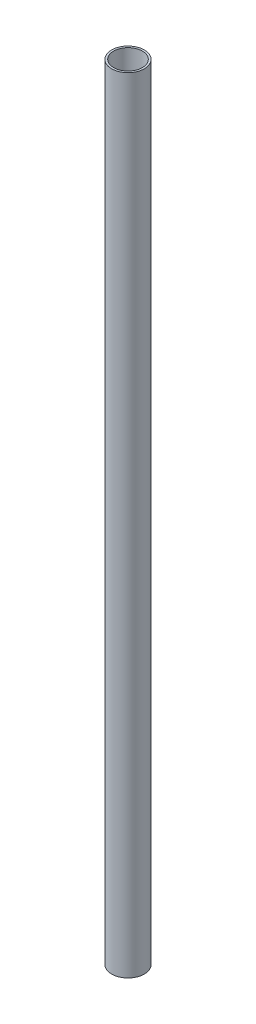
ISO-10303-21;
HEADER;
FILE_DESCRIPTION(('STEP AP214'),'2;1');
FILE_NAME('part.step','',(''),(''),'','','');
FILE_SCHEMA(('AUTOMOTIVE_DESIGN { 1 0 10303 214 1 1 1 1 }'));
ENDSEC;
DATA;
#1=APPLICATION_CONTEXT('core data for automotive mechanical design processes');
#2=APPLICATION_PROTOCOL_DEFINITION('international standard','automotive_design',2000,#1);
#3=PRODUCT_CONTEXT('',#1,'mechanical');
#4=PRODUCT('Part','Part','',(#3));
#5=PRODUCT_RELATED_PRODUCT_CATEGORY('part','',(#4));
#6=PRODUCT_DEFINITION_FORMATION('','',#4);
#7=PRODUCT_DEFINITION_CONTEXT('part definition',#1,'design');
#8=PRODUCT_DEFINITION('design','',#6,#7);
#9=PRODUCT_DEFINITION_SHAPE('','',#8);
#10=(LENGTH_UNIT() NAMED_UNIT(*) SI_UNIT(.MILLI.,.METRE.));
#11=(NAMED_UNIT(*) PLANE_ANGLE_UNIT() SI_UNIT($,.RADIAN.));
#12=(NAMED_UNIT(*) SI_UNIT($,.STERADIAN.) SOLID_ANGLE_UNIT());
#13=UNCERTAINTY_MEASURE_WITH_UNIT(LENGTH_MEASURE(1.E-05),#10,'distance_accuracy_value','');
#14=(GEOMETRIC_REPRESENTATION_CONTEXT(3) GLOBAL_UNCERTAINTY_ASSIGNED_CONTEXT((#13)) GLOBAL_UNIT_ASSIGNED_CONTEXT((#10,
#11,#12)) REPRESENTATION_CONTEXT('',''));
#15=CARTESIAN_POINT('',(0.,0.,0.));
#16=DIRECTION('',(0.,0.,1.));
#17=DIRECTION('',(1.,0.,0.));
#18=AXIS2_PLACEMENT_3D('',#15,#16,#17);
#19=CARTESIAN_POINT('',(0.,300.,0.));
#20=DIRECTION('',(0.,1.,0.));
#21=DIRECTION('',(0.,0.,1.));
#22=AXIS2_PLACEMENT_3D('',#19,#20,#21);
#23=PLANE('',#22);
#24=CARTESIAN_POINT('',(0.,300.,0.));
#25=DIRECTION('',(0.,1.,0.));
#26=DIRECTION('',(0.,0.,1.));
#27=AXIS2_PLACEMENT_3D('',#24,#25,#26);
#28=CIRCLE('',#27,12.5);
#29=CARTESIAN_POINT('',(0.,300.,12.5));
#30=VERTEX_POINT('',#29);
#31=EDGE_CURVE('E10',#30,#30,#28,.T.);
#32=ORIENTED_EDGE('',*,*,#31,.T.);
#33=EDGE_LOOP('',(#32));
#34=FACE_BOUND('',#33,.T.);
#35=CARTESIAN_POINT('',(0.,300.,0.));
#36=DIRECTION('',(0.,1.,0.));
#37=DIRECTION('',(0.,0.,1.));
#38=AXIS2_PLACEMENT_3D('',#35,#36,#37);
#39=CIRCLE('',#38,11.);
#40=CARTESIAN_POINT('',(0.,300.,11.));
#41=VERTEX_POINT('',#40);
#42=EDGE_CURVE('E46',#41,#41,#39,.T.);
#43=ORIENTED_EDGE('',*,*,#42,.F.);
#44=EDGE_LOOP('',(#43));
#45=FACE_BOUND('',#44,.T.);
#46=ADVANCED_FACE('F35',(#34,#45),#23,.T.);
#47=CARTESIAN_POINT('',(0.,-300.,0.));
#48=DIRECTION('',(0.,1.,0.));
#49=DIRECTION('',(0.,0.,1.));
#50=AXIS2_PLACEMENT_3D('',#47,#48,#49);
#51=PLANE('',#50);
#52=CARTESIAN_POINT('',(0.,-300.,0.));
#53=DIRECTION('',(0.,1.,0.));
#54=DIRECTION('',(0.,0.,1.));
#55=AXIS2_PLACEMENT_3D('',#52,#53,#54);
#56=CIRCLE('',#55,12.5);
#57=CARTESIAN_POINT('',(0.,-300.,12.5));
#58=VERTEX_POINT('',#57);
#59=EDGE_CURVE('E39',#58,#58,#56,.T.);
#60=ORIENTED_EDGE('',*,*,#59,.F.);
#61=EDGE_LOOP('',(#60));
#62=FACE_BOUND('',#61,.T.);
#63=CARTESIAN_POINT('',(0.,-300.,0.));
#64=DIRECTION('',(0.,1.,0.));
#65=DIRECTION('',(0.,0.,1.));
#66=AXIS2_PLACEMENT_3D('',#63,#64,#65);
#67=CIRCLE('',#66,11.);
#68=CARTESIAN_POINT('',(0.,-300.,11.));
#69=VERTEX_POINT('',#68);
#70=EDGE_CURVE('E48',#69,#69,#67,.T.);
#71=ORIENTED_EDGE('',*,*,#70,.T.);
#72=EDGE_LOOP('',(#71));
#73=FACE_BOUND('',#72,.T.);
#74=ADVANCED_FACE('F58',(#62,#73),#51,.F.);
#75=CARTESIAN_POINT('',(0.,300.,0.));
#76=DIRECTION('',(0.,-1.,0.));
#77=DIRECTION('',(0.,0.,-1.));
#78=AXIS2_PLACEMENT_3D('',#75,#76,#77);
#79=CYLINDRICAL_SURFACE('',#78,12.5);
#80=ORIENTED_EDGE('',*,*,#31,.F.);
#81=EDGE_LOOP('',(#80));
#82=FACE_BOUND('',#81,.T.);
#83=ORIENTED_EDGE('',*,*,#59,.T.);
#84=EDGE_LOOP('',(#83));
#85=FACE_BOUND('',#84,.T.);
#86=ADVANCED_FACE('F37',(#82,#85),#79,.T.);
#87=CARTESIAN_POINT('',(0.,300.,0.));
#88=DIRECTION('',(0.,-1.,0.));
#89=DIRECTION('',(0.,0.,-1.));
#90=AXIS2_PLACEMENT_3D('',#87,#88,#89);
#91=CYLINDRICAL_SURFACE('',#90,11.);
#92=ORIENTED_EDGE('',*,*,#42,.T.);
#93=EDGE_LOOP('',(#92));
#94=FACE_BOUND('',#93,.T.);
#95=ORIENTED_EDGE('',*,*,#70,.F.);
#96=EDGE_LOOP('',(#95));
#97=FACE_BOUND('',#96,.T.);
#98=ADVANCED_FACE('F54',(#94,#97),#91,.F.);
#99=CLOSED_SHELL('',(#46,#74,#86,#98));
#100=MANIFOLD_SOLID_BREP('B2',#99);
#101=ADVANCED_BREP_SHAPE_REPRESENTATION('',(#18,#100),#14);
#102=SHAPE_DEFINITION_REPRESENTATION(#9,#101);
ENDSEC;
END-ISO-10303-21;
